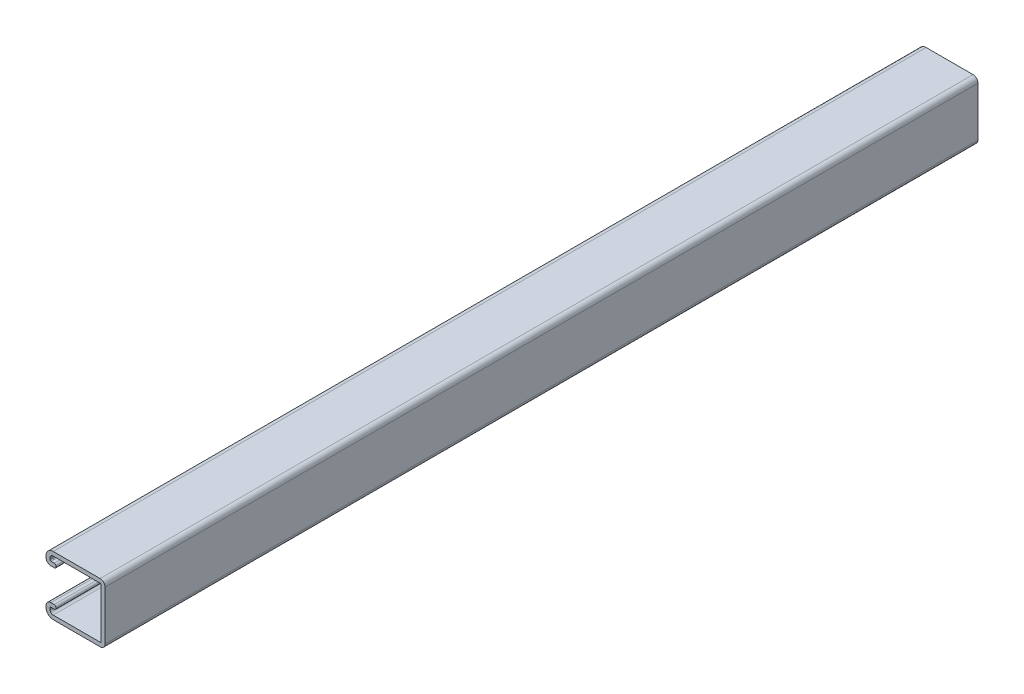
ISO-10303-21;
HEADER;
FILE_DESCRIPTION(('STEP AP214'),'2;1');
FILE_NAME('part.step','',(''),(''),'','','');
FILE_SCHEMA(('AUTOMOTIVE_DESIGN { 1 0 10303 214 1 1 1 1 }'));
ENDSEC;
DATA;
#1=APPLICATION_CONTEXT('core data for automotive mechanical design processes');
#2=APPLICATION_PROTOCOL_DEFINITION('international standard','automotive_design',2000,#1);
#3=PRODUCT_CONTEXT('',#1,'mechanical');
#4=PRODUCT('Part','Part','',(#3));
#5=PRODUCT_RELATED_PRODUCT_CATEGORY('part','',(#4));
#6=PRODUCT_DEFINITION_FORMATION('','',#4);
#7=PRODUCT_DEFINITION_CONTEXT('part definition',#1,'design');
#8=PRODUCT_DEFINITION('design','',#6,#7);
#9=PRODUCT_DEFINITION_SHAPE('','',#8);
#10=(LENGTH_UNIT() NAMED_UNIT(*) SI_UNIT(.MILLI.,.METRE.));
#11=(NAMED_UNIT(*) PLANE_ANGLE_UNIT() SI_UNIT($,.RADIAN.));
#12=(NAMED_UNIT(*) SI_UNIT($,.STERADIAN.) SOLID_ANGLE_UNIT());
#13=UNCERTAINTY_MEASURE_WITH_UNIT(LENGTH_MEASURE(1.E-05),#10,'distance_accuracy_value','');
#14=(GEOMETRIC_REPRESENTATION_CONTEXT(3) GLOBAL_UNCERTAINTY_ASSIGNED_CONTEXT((#13)) GLOBAL_UNIT_ASSIGNED_CONTEXT((#10,
#11,#12)) REPRESENTATION_CONTEXT('',''));
#15=CARTESIAN_POINT('',(0.,0.,0.));
#16=DIRECTION('',(0.,0.,1.));
#17=DIRECTION('',(1.,0.,0.));
#18=AXIS2_PLACEMENT_3D('',#15,#16,#17);
#19=CARTESIAN_POINT('',(-36.22675,15.58925,-609.6));
#20=DIRECTION('',(0.,0.,1.));
#21=DIRECTION('',(1.,0.,0.));
#22=AXIS2_PLACEMENT_3D('',#19,#20,#21);
#23=CYLINDRICAL_SURFACE('',#22,5.04825);
#24=CARTESIAN_POINT('',(-36.22675,15.58925,0.));
#25=DIRECTION('',(0.,0.,1.));
#26=DIRECTION('',(1.,0.,0.));
#27=AXIS2_PLACEMENT_3D('',#24,#25,#26);
#28=CIRCLE('',#27,5.04825);
#29=CARTESIAN_POINT('',(-36.22675,20.6375,0.));
#30=VERTEX_POINT('',#29);
#31=CARTESIAN_POINT('',(-41.275,15.58925,0.));
#32=VERTEX_POINT('',#31);
#33=EDGE_CURVE('E256',#30,#32,#28,.T.);
#34=ORIENTED_EDGE('',*,*,#33,.F.);
#35=DIRECTION('',(0.,0.,1.));
#36=VECTOR('',#35,1.);
#37=CARTESIAN_POINT('',(-36.22675,20.6375,-609.6));
#38=LINE('',#37,#36);
#39=CARTESIAN_POINT('',(-36.22675,20.6375,-609.6));
#40=VERTEX_POINT('',#39);
#41=EDGE_CURVE('E11',#40,#30,#38,.T.);
#42=ORIENTED_EDGE('',*,*,#41,.F.);
#43=CARTESIAN_POINT('',(-36.22675,15.58925,-609.6));
#44=DIRECTION('',(0.,0.,1.));
#45=DIRECTION('',(1.,0.,0.));
#46=AXIS2_PLACEMENT_3D('',#43,#44,#45);
#47=CIRCLE('',#46,5.04825);
#48=CARTESIAN_POINT('',(-41.275,15.58925,-609.6));
#49=VERTEX_POINT('',#48);
#50=EDGE_CURVE('E336',#40,#49,#47,.T.);
#51=ORIENTED_EDGE('',*,*,#50,.T.);
#52=DIRECTION('',(0.,0.,1.));
#53=VECTOR('',#52,1.);
#54=CARTESIAN_POINT('',(-41.275,15.58925,-609.6));
#55=LINE('',#54,#53);
#56=EDGE_CURVE('E42',#49,#32,#55,.T.);
#57=ORIENTED_EDGE('',*,*,#56,.T.);
#58=EDGE_LOOP('',(#34,#42,#51,#57));
#59=FACE_BOUND('',#58,.T.);
#60=ADVANCED_FACE('F39',(#59),#23,.T.);
#61=CARTESIAN_POINT('',(-36.22675,20.6375,-609.6));
#62=DIRECTION('',(0.,1.,0.));
#63=DIRECTION('',(-1.,0.,0.));
#64=AXIS2_PLACEMENT_3D('',#61,#62,#63);
#65=PLANE('',#64);
#66=DIRECTION('',(-1.,0.,0.));
#67=VECTOR('',#66,1.);
#68=CARTESIAN_POINT('',(-36.22675,20.6375,0.));
#69=LINE('',#68,#67);
#70=CARTESIAN_POINT('',(-3.46075,20.6375,0.));
#71=VERTEX_POINT('',#70);
#72=EDGE_CURVE('E334',#71,#30,#69,.T.);
#73=ORIENTED_EDGE('',*,*,#72,.F.);
#74=DIRECTION('',(0.,0.,1.));
#75=VECTOR('',#74,1.);
#76=CARTESIAN_POINT('',(-3.46075,20.6375,-609.6));
#77=LINE('',#76,#75);
#78=CARTESIAN_POINT('',(-3.46075,20.6375,-609.6));
#79=VERTEX_POINT('',#78);
#80=EDGE_CURVE('E48',#79,#71,#77,.T.);
#81=ORIENTED_EDGE('',*,*,#80,.F.);
#82=DIRECTION('',(-1.,0.,0.));
#83=VECTOR('',#82,1.);
#84=CARTESIAN_POINT('',(-36.22675,20.6375,-609.6));
#85=LINE('',#84,#83);
#86=EDGE_CURVE('E246',#79,#40,#85,.T.);
#87=ORIENTED_EDGE('',*,*,#86,.T.);
#88=ORIENTED_EDGE('',*,*,#41,.T.);
#89=EDGE_LOOP('',(#73,#81,#87,#88));
#90=FACE_BOUND('',#89,.T.);
#91=ADVANCED_FACE('F388',(#90),#65,.T.);
#92=CARTESIAN_POINT('',(-3.46075,17.17675,-609.6));
#93=DIRECTION('',(0.,0.,1.));
#94=DIRECTION('',(1.,0.,0.));
#95=AXIS2_PLACEMENT_3D('',#92,#93,#94);
#96=CYLINDRICAL_SURFACE('',#95,3.46075);
#97=CARTESIAN_POINT('',(-3.46075,17.17675,0.));
#98=DIRECTION('',(0.,0.,1.));
#99=DIRECTION('',(1.,0.,0.));
#100=AXIS2_PLACEMENT_3D('',#97,#98,#99);
#101=CIRCLE('',#100,3.46075);
#102=CARTESIAN_POINT('',(0.,17.17675,0.));
#103=VERTEX_POINT('',#102);
#104=EDGE_CURVE('E233',#103,#71,#101,.T.);
#105=ORIENTED_EDGE('',*,*,#104,.F.);
#106=DIRECTION('',(0.,0.,1.));
#107=VECTOR('',#106,1.);
#108=CARTESIAN_POINT('',(0.,17.17675,-609.6));
#109=LINE('',#108,#107);
#110=CARTESIAN_POINT('',(0.,17.17675,-609.6));
#111=VERTEX_POINT('',#110);
#112=EDGE_CURVE('E228',#111,#103,#109,.T.);
#113=ORIENTED_EDGE('',*,*,#112,.F.);
#114=CARTESIAN_POINT('',(-3.46075,17.17675,-609.6));
#115=DIRECTION('',(0.,0.,1.));
#116=DIRECTION('',(1.,0.,0.));
#117=AXIS2_PLACEMENT_3D('',#114,#115,#116);
#118=CIRCLE('',#117,3.46075);
#119=EDGE_CURVE('E231',#111,#79,#118,.T.);
#120=ORIENTED_EDGE('',*,*,#119,.T.);
#121=ORIENTED_EDGE('',*,*,#80,.T.);
#122=EDGE_LOOP('',(#105,#113,#120,#121));
#123=FACE_BOUND('',#122,.T.);
#124=ADVANCED_FACE('F230',(#123),#96,.T.);
#125=CARTESIAN_POINT('',(0.,17.17675,-609.6));
#126=DIRECTION('',(1.,0.,0.));
#127=DIRECTION('',(0.,1.,0.));
#128=AXIS2_PLACEMENT_3D('',#125,#126,#127);
#129=PLANE('',#128);
#130=DIRECTION('',(0.,1.,0.));
#131=VECTOR('',#130,1.);
#132=CARTESIAN_POINT('',(0.,17.17675,0.));
#133=LINE('',#132,#131);
#134=CARTESIAN_POINT('',(0.,-17.17675,0.));
#135=VERTEX_POINT('',#134);
#136=EDGE_CURVE('E331',#135,#103,#133,.T.);
#137=ORIENTED_EDGE('',*,*,#136,.F.);
#138=DIRECTION('',(0.,0.,1.));
#139=VECTOR('',#138,1.);
#140=CARTESIAN_POINT('',(0.,-17.17675,-609.6));
#141=LINE('',#140,#139);
#142=CARTESIAN_POINT('',(0.,-17.17675,-609.6));
#143=VERTEX_POINT('',#142);
#144=EDGE_CURVE('E238',#143,#135,#141,.T.);
#145=ORIENTED_EDGE('',*,*,#144,.F.);
#146=DIRECTION('',(0.,1.,0.));
#147=VECTOR('',#146,1.);
#148=CARTESIAN_POINT('',(0.,17.17675,-609.6));
#149=LINE('',#148,#147);
#150=EDGE_CURVE('E244',#143,#111,#149,.T.);
#151=ORIENTED_EDGE('',*,*,#150,.T.);
#152=ORIENTED_EDGE('',*,*,#112,.T.);
#153=EDGE_LOOP('',(#137,#145,#151,#152));
#154=FACE_BOUND('',#153,.T.);
#155=ADVANCED_FACE('F248',(#154),#129,.T.);
#156=CARTESIAN_POINT('',(-3.46075,-17.17675,-609.6));
#157=DIRECTION('',(0.,0.,1.));
#158=DIRECTION('',(1.,0.,0.));
#159=AXIS2_PLACEMENT_3D('',#156,#157,#158);
#160=CYLINDRICAL_SURFACE('',#159,3.46075);
#161=CARTESIAN_POINT('',(-3.46075,-17.17675,0.));
#162=DIRECTION('',(0.,0.,1.));
#163=DIRECTION('',(-1.,0.,0.));
#164=AXIS2_PLACEMENT_3D('',#161,#162,#163);
#165=CIRCLE('',#164,3.46075);
#166=CARTESIAN_POINT('',(-3.46075,-20.6375,0.));
#167=VERTEX_POINT('',#166);
#168=EDGE_CURVE('E328',#167,#135,#165,.T.);
#169=ORIENTED_EDGE('',*,*,#168,.F.);
#170=DIRECTION('',(0.,0.,1.));
#171=VECTOR('',#170,1.);
#172=CARTESIAN_POINT('',(-3.46075,-20.6375,-609.6));
#173=LINE('',#172,#171);
#174=CARTESIAN_POINT('',(-3.46075,-20.6375,-609.6));
#175=VERTEX_POINT('',#174);
#176=EDGE_CURVE('E340',#175,#167,#173,.T.);
#177=ORIENTED_EDGE('',*,*,#176,.F.);
#178=CARTESIAN_POINT('',(-3.46075,-17.17675,-609.6));
#179=DIRECTION('',(0.,0.,1.));
#180=DIRECTION('',(-1.,0.,0.));
#181=AXIS2_PLACEMENT_3D('',#178,#179,#180);
#182=CIRCLE('',#181,3.46075);
#183=EDGE_CURVE('E249',#175,#143,#182,.T.);
#184=ORIENTED_EDGE('',*,*,#183,.T.);
#185=ORIENTED_EDGE('',*,*,#144,.T.);
#186=EDGE_LOOP('',(#169,#177,#184,#185));
#187=FACE_BOUND('',#186,.T.);
#188=ADVANCED_FACE('F401',(#187),#160,.T.);
#189=CARTESIAN_POINT('',(-36.22675,-20.6375,-609.6));
#190=DIRECTION('',(0.,-1.,0.));
#191=DIRECTION('',(1.,0.,0.));
#192=AXIS2_PLACEMENT_3D('',#189,#190,#191);
#193=PLANE('',#192);
#194=DIRECTION('',(1.,0.,0.));
#195=VECTOR('',#194,1.);
#196=CARTESIAN_POINT('',(-36.22675,-20.6375,0.));
#197=LINE('',#196,#195);
#198=CARTESIAN_POINT('',(-36.22675,-20.6375,0.));
#199=VERTEX_POINT('',#198);
#200=EDGE_CURVE('E325',#199,#167,#197,.T.);
#201=ORIENTED_EDGE('',*,*,#200,.F.);
#202=DIRECTION('',(0.,0.,1.));
#203=VECTOR('',#202,1.);
#204=CARTESIAN_POINT('',(-36.22675,-20.6375,-609.6));
#205=LINE('',#204,#203);
#206=CARTESIAN_POINT('',(-36.22675,-20.6375,-609.6));
#207=VERTEX_POINT('',#206);
#208=EDGE_CURVE('E342',#207,#199,#205,.T.);
#209=ORIENTED_EDGE('',*,*,#208,.F.);
#210=DIRECTION('',(1.,0.,0.));
#211=VECTOR('',#210,1.);
#212=CARTESIAN_POINT('',(-36.22675,-20.6375,-609.6));
#213=LINE('',#212,#211);
#214=EDGE_CURVE('E251',#207,#175,#213,.T.);
#215=ORIENTED_EDGE('',*,*,#214,.T.);
#216=ORIENTED_EDGE('',*,*,#176,.T.);
#217=EDGE_LOOP('',(#201,#209,#215,#216));
#218=FACE_BOUND('',#217,.T.);
#219=ADVANCED_FACE('F404',(#218),#193,.T.);
#220=CARTESIAN_POINT('',(-36.22675,-15.58925,-609.6));
#221=DIRECTION('',(0.,0.,1.));
#222=DIRECTION('',(1.,0.,0.));
#223=AXIS2_PLACEMENT_3D('',#220,#221,#222);
#224=CYLINDRICAL_SURFACE('',#223,5.04825);
#225=CARTESIAN_POINT('',(-36.22675,-15.58925,0.));
#226=DIRECTION('',(0.,0.,1.));
#227=DIRECTION('',(-1.,0.,0.));
#228=AXIS2_PLACEMENT_3D('',#225,#226,#227);
#229=CIRCLE('',#228,5.04825);
#230=CARTESIAN_POINT('',(-41.275,-15.58925,0.));
#231=VERTEX_POINT('',#230);
#232=EDGE_CURVE('E322',#231,#199,#229,.T.);
#233=ORIENTED_EDGE('',*,*,#232,.F.);
#234=DIRECTION('',(0.,0.,1.));
#235=VECTOR('',#234,1.);
#236=CARTESIAN_POINT('',(-41.275,-15.58925,-609.6));
#237=LINE('',#236,#235);
#238=CARTESIAN_POINT('',(-41.275,-15.58925,-609.6));
#239=VERTEX_POINT('',#238);
#240=EDGE_CURVE('E344',#239,#231,#237,.T.);
#241=ORIENTED_EDGE('',*,*,#240,.F.);
#242=CARTESIAN_POINT('',(-36.22675,-15.58925,-609.6));
#243=DIRECTION('',(0.,0.,1.));
#244=DIRECTION('',(-1.,0.,0.));
#245=AXIS2_PLACEMENT_3D('',#242,#243,#244);
#246=CIRCLE('',#245,5.04825);
#247=EDGE_CURVE('E749',#239,#207,#246,.T.);
#248=ORIENTED_EDGE('',*,*,#247,.T.);
#249=ORIENTED_EDGE('',*,*,#208,.T.);
#250=EDGE_LOOP('',(#233,#241,#248,#249));
#251=FACE_BOUND('',#250,.T.);
#252=ADVANCED_FACE('F408',(#251),#224,.T.);
#253=CARTESIAN_POINT('',(-41.275,-15.58925,-609.6));
#254=DIRECTION('',(-1.,0.,0.));
#255=DIRECTION('',(0.,0.,1.));
#256=AXIS2_PLACEMENT_3D('',#253,#254,#255);
#257=PLANE('',#256);
#258=DIRECTION('',(0.,-1.,0.));
#259=VECTOR('',#258,1.);
#260=CARTESIAN_POINT('',(-41.275,-15.58925,0.));
#261=LINE('',#260,#259);
#262=CARTESIAN_POINT('',(-41.275,-14.57325,0.));
#263=VERTEX_POINT('',#262);
#264=EDGE_CURVE('E319',#263,#231,#261,.T.);
#265=ORIENTED_EDGE('',*,*,#264,.F.);
#266=DIRECTION('',(0.,0.,1.));
#267=VECTOR('',#266,1.);
#268=CARTESIAN_POINT('',(-41.275,-14.57325,-609.6));
#269=LINE('',#268,#267);
#270=CARTESIAN_POINT('',(-41.275,-14.57325,-609.6));
#271=VERTEX_POINT('',#270);
#272=EDGE_CURVE('E346',#271,#263,#269,.T.);
#273=ORIENTED_EDGE('',*,*,#272,.F.);
#274=DIRECTION('',(0.,-1.,0.));
#275=VECTOR('',#274,1.);
#276=CARTESIAN_POINT('',(-41.275,-15.58925,-609.6));
#277=LINE('',#276,#275);
#278=EDGE_CURVE('E745',#271,#239,#277,.T.);
#279=ORIENTED_EDGE('',*,*,#278,.T.);
#280=ORIENTED_EDGE('',*,*,#240,.T.);
#281=EDGE_LOOP('',(#265,#273,#279,#280));
#282=FACE_BOUND('',#281,.T.);
#283=ADVANCED_FACE('F412',(#282),#257,.T.);
#284=CARTESIAN_POINT('',(-37.81425,-14.57325,-609.6));
#285=DIRECTION('',(0.,0.,1.));
#286=DIRECTION('',(1.,0.,0.));
#287=AXIS2_PLACEMENT_3D('',#284,#285,#286);
#288=CYLINDRICAL_SURFACE('',#287,3.46075);
#289=CARTESIAN_POINT('',(-37.81425,-14.57325,0.));
#290=DIRECTION('',(0.,0.,1.));
#291=DIRECTION('',(-1.,0.,0.));
#292=AXIS2_PLACEMENT_3D('',#289,#290,#291);
#293=CIRCLE('',#292,3.46075);
#294=CARTESIAN_POINT('',(-37.81425,-11.1125,0.));
#295=VERTEX_POINT('',#294);
#296=EDGE_CURVE('E316',#295,#263,#293,.T.);
#297=ORIENTED_EDGE('',*,*,#296,.F.);
#298=DIRECTION('',(0.,0.,1.));
#299=VECTOR('',#298,1.);
#300=CARTESIAN_POINT('',(-37.81425,-11.1125,-609.6));
#301=LINE('',#300,#299);
#302=CARTESIAN_POINT('',(-37.81425,-11.1125,-609.6));
#303=VERTEX_POINT('',#302);
#304=EDGE_CURVE('E348',#303,#295,#301,.T.);
#305=ORIENTED_EDGE('',*,*,#304,.F.);
#306=CARTESIAN_POINT('',(-37.81425,-14.57325,-609.6));
#307=DIRECTION('',(0.,0.,1.));
#308=DIRECTION('',(-1.,0.,0.));
#309=AXIS2_PLACEMENT_3D('',#306,#307,#308);
#310=CIRCLE('',#309,3.46075);
#311=EDGE_CURVE('E756',#303,#271,#310,.T.);
#312=ORIENTED_EDGE('',*,*,#311,.T.);
#313=ORIENTED_EDGE('',*,*,#272,.T.);
#314=EDGE_LOOP('',(#297,#305,#312,#313));
#315=FACE_BOUND('',#314,.T.);
#316=ADVANCED_FACE('F416',(#315),#288,.T.);
#317=CARTESIAN_POINT('',(-37.81425,-11.1125,-609.6));
#318=DIRECTION('',(0.,1.,0.));
#319=DIRECTION('',(-1.,0.,0.));
#320=AXIS2_PLACEMENT_3D('',#317,#318,#319);
#321=PLANE('',#320);
#322=DIRECTION('',(-1.,0.,0.));
#323=VECTOR('',#322,1.);
#324=CARTESIAN_POINT('',(-37.81425,-11.1125,0.));
#325=LINE('',#324,#323);
#326=CARTESIAN_POINT('',(-35.5346,-11.1125,0.));
#327=VERTEX_POINT('',#326);
#328=EDGE_CURVE('E313',#327,#295,#325,.T.);
#329=ORIENTED_EDGE('',*,*,#328,.F.);
#330=DIRECTION('',(0.,0.,1.));
#331=VECTOR('',#330,1.);
#332=CARTESIAN_POINT('',(-35.5346,-11.1125,-609.6));
#333=LINE('',#332,#331);
#334=CARTESIAN_POINT('',(-35.5346,-11.1125,-609.6));
#335=VERTEX_POINT('',#334);
#336=EDGE_CURVE('E350',#335,#327,#333,.T.);
#337=ORIENTED_EDGE('',*,*,#336,.F.);
#338=DIRECTION('',(-1.,0.,0.));
#339=VECTOR('',#338,1.);
#340=CARTESIAN_POINT('',(-37.81425,-11.1125,-609.6));
#341=LINE('',#340,#339);
#342=EDGE_CURVE('E738',#335,#303,#341,.T.);
#343=ORIENTED_EDGE('',*,*,#342,.T.);
#344=ORIENTED_EDGE('',*,*,#304,.T.);
#345=EDGE_LOOP('',(#329,#337,#343,#344));
#346=FACE_BOUND('',#345,.T.);
#347=ADVANCED_FACE('F420',(#346),#321,.T.);
#348=CARTESIAN_POINT('',(-35.5346,-12.5095,-609.6));
#349=DIRECTION('',(0.,0.,1.));
#350=DIRECTION('',(1.,0.,0.));
#351=AXIS2_PLACEMENT_3D('',#348,#349,#350);
#352=CYLINDRICAL_SURFACE('',#351,1.397);
#353=CARTESIAN_POINT('',(-35.5346,-12.5095,0.));
#354=DIRECTION('',(0.,0.,1.));
#355=DIRECTION('',(-1.,0.,0.));
#356=AXIS2_PLACEMENT_3D('',#353,#354,#355);
#357=CIRCLE('',#356,1.397);
#358=CARTESIAN_POINT('',(-35.5346,-13.9065,0.));
#359=VERTEX_POINT('',#358);
#360=EDGE_CURVE('E310',#359,#327,#357,.T.);
#361=ORIENTED_EDGE('',*,*,#360,.F.);
#362=DIRECTION('',(0.,0.,1.));
#363=VECTOR('',#362,1.);
#364=CARTESIAN_POINT('',(-35.5346,-13.9065,-609.6));
#365=LINE('',#364,#363);
#366=CARTESIAN_POINT('',(-35.5346,-13.9065,-609.6));
#367=VERTEX_POINT('',#366);
#368=EDGE_CURVE('E352',#367,#359,#365,.T.);
#369=ORIENTED_EDGE('',*,*,#368,.F.);
#370=CARTESIAN_POINT('',(-35.5346,-12.5095,-609.6));
#371=DIRECTION('',(0.,0.,1.));
#372=DIRECTION('',(-1.,0.,0.));
#373=AXIS2_PLACEMENT_3D('',#370,#371,#372);
#374=CIRCLE('',#373,1.397);
#375=EDGE_CURVE('E734',#367,#335,#374,.T.);
#376=ORIENTED_EDGE('',*,*,#375,.T.);
#377=ORIENTED_EDGE('',*,*,#336,.T.);
#378=EDGE_LOOP('',(#361,#369,#376,#377));
#379=FACE_BOUND('',#378,.T.);
#380=ADVANCED_FACE('F424',(#379),#352,.T.);
#381=CARTESIAN_POINT('',(-35.5346,-13.9065,-609.6));
#382=DIRECTION('',(0.,-1.,0.));
#383=DIRECTION('',(0.,0.,-1.));
#384=AXIS2_PLACEMENT_3D('',#381,#382,#383);
#385=PLANE('',#384);
#386=DIRECTION('',(1.,0.,0.));
#387=VECTOR('',#386,1.);
#388=CARTESIAN_POINT('',(-35.5346,-13.9065,0.));
#389=LINE('',#388,#387);
#390=CARTESIAN_POINT('',(-37.81425,-13.9065,0.));
#391=VERTEX_POINT('',#390);
#392=EDGE_CURVE('E307',#391,#359,#389,.T.);
#393=ORIENTED_EDGE('',*,*,#392,.F.);
#394=DIRECTION('',(0.,0.,1.));
#395=VECTOR('',#394,1.);
#396=CARTESIAN_POINT('',(-37.81425,-13.9065,-609.6));
#397=LINE('',#396,#395);
#398=CARTESIAN_POINT('',(-37.81425,-13.9065,-609.6));
#399=VERTEX_POINT('',#398);
#400=EDGE_CURVE('E354',#399,#391,#397,.T.);
#401=ORIENTED_EDGE('',*,*,#400,.F.);
#402=DIRECTION('',(1.,0.,0.));
#403=VECTOR('',#402,1.);
#404=CARTESIAN_POINT('',(-35.5346,-13.9065,-609.6));
#405=LINE('',#404,#403);
#406=EDGE_CURVE('E760',#399,#367,#405,.T.);
#407=ORIENTED_EDGE('',*,*,#406,.T.);
#408=ORIENTED_EDGE('',*,*,#368,.T.);
#409=EDGE_LOOP('',(#393,#401,#407,#408));
#410=FACE_BOUND('',#409,.T.);
#411=ADVANCED_FACE('F428',(#410),#385,.T.);
#412=CARTESIAN_POINT('',(-37.81425,-14.57325,-609.6));
#413=DIRECTION('',(0.,0.,1.));
#414=DIRECTION('',(1.,0.,0.));
#415=AXIS2_PLACEMENT_3D('',#412,#413,#414);
#416=CYLINDRICAL_SURFACE('',#415,0.666750000000008);
#417=CARTESIAN_POINT('',(-37.81425,-14.57325,0.));
#418=DIRECTION('',(0.,0.,-1.));
#419=DIRECTION('',(1.,0.,0.));
#420=AXIS2_PLACEMENT_3D('',#417,#418,#419);
#421=CIRCLE('',#420,0.666750000000008);
#422=CARTESIAN_POINT('',(-38.481,-14.57325,0.));
#423=VERTEX_POINT('',#422);
#424=EDGE_CURVE('E304',#423,#391,#421,.T.);
#425=ORIENTED_EDGE('',*,*,#424,.F.);
#426=DIRECTION('',(0.,0.,1.));
#427=VECTOR('',#426,1.);
#428=CARTESIAN_POINT('',(-38.481,-14.57325,-609.6));
#429=LINE('',#428,#427);
#430=CARTESIAN_POINT('',(-38.481,-14.57325,-609.6));
#431=VERTEX_POINT('',#430);
#432=EDGE_CURVE('E356',#431,#423,#429,.T.);
#433=ORIENTED_EDGE('',*,*,#432,.F.);
#434=CARTESIAN_POINT('',(-37.81425,-14.57325,-609.6));
#435=DIRECTION('',(0.,0.,-1.));
#436=DIRECTION('',(1.,0.,0.));
#437=AXIS2_PLACEMENT_3D('',#434,#435,#436);
#438=CIRCLE('',#437,0.666750000000008);
#439=EDGE_CURVE('E727',#431,#399,#438,.T.);
#440=ORIENTED_EDGE('',*,*,#439,.T.);
#441=ORIENTED_EDGE('',*,*,#400,.T.);
#442=EDGE_LOOP('',(#425,#433,#440,#441));
#443=FACE_BOUND('',#442,.T.);
#444=ADVANCED_FACE('F432',(#443),#416,.F.);
#445=CARTESIAN_POINT('',(-38.481,-14.57325,-609.6));
#446=DIRECTION('',(1.,0.,0.));
#447=DIRECTION('',(0.,0.,-1.));
#448=AXIS2_PLACEMENT_3D('',#445,#446,#447);
#449=PLANE('',#448);
#450=DIRECTION('',(0.,1.,0.));
#451=VECTOR('',#450,1.);
#452=CARTESIAN_POINT('',(-38.481,-14.57325,0.));
#453=LINE('',#452,#451);
#454=CARTESIAN_POINT('',(-38.481,-15.58925,0.));
#455=VERTEX_POINT('',#454);
#456=EDGE_CURVE('E301',#455,#423,#453,.T.);
#457=ORIENTED_EDGE('',*,*,#456,.F.);
#458=DIRECTION('',(0.,0.,1.));
#459=VECTOR('',#458,1.);
#460=CARTESIAN_POINT('',(-38.481,-15.58925,-609.6));
#461=LINE('',#460,#459);
#462=CARTESIAN_POINT('',(-38.481,-15.58925,-609.6));
#463=VERTEX_POINT('',#462);
#464=EDGE_CURVE('E358',#463,#455,#461,.T.);
#465=ORIENTED_EDGE('',*,*,#464,.F.);
#466=DIRECTION('',(0.,1.,0.));
#467=VECTOR('',#466,1.);
#468=CARTESIAN_POINT('',(-38.481,-14.57325,-609.6));
#469=LINE('',#468,#467);
#470=EDGE_CURVE('E723',#463,#431,#469,.T.);
#471=ORIENTED_EDGE('',*,*,#470,.T.);
#472=ORIENTED_EDGE('',*,*,#432,.T.);
#473=EDGE_LOOP('',(#457,#465,#471,#472));
#474=FACE_BOUND('',#473,.T.);
#475=ADVANCED_FACE('F436',(#474),#449,.T.);
#476=CARTESIAN_POINT('',(-36.22675,-15.58925,-609.6));
#477=DIRECTION('',(0.,0.,1.));
#478=DIRECTION('',(1.,0.,0.));
#479=AXIS2_PLACEMENT_3D('',#476,#477,#478);
#480=CYLINDRICAL_SURFACE('',#479,2.25425);
#481=CARTESIAN_POINT('',(-36.22675,-15.58925,0.));
#482=DIRECTION('',(0.,0.,-1.));
#483=DIRECTION('',(1.,0.,0.));
#484=AXIS2_PLACEMENT_3D('',#481,#482,#483);
#485=CIRCLE('',#484,2.25425);
#486=CARTESIAN_POINT('',(-36.22675,-17.8435,0.));
#487=VERTEX_POINT('',#486);
#488=EDGE_CURVE('E298',#487,#455,#485,.T.);
#489=ORIENTED_EDGE('',*,*,#488,.F.);
#490=DIRECTION('',(0.,0.,1.));
#491=VECTOR('',#490,1.);
#492=CARTESIAN_POINT('',(-36.22675,-17.8435,-609.6));
#493=LINE('',#492,#491);
#494=CARTESIAN_POINT('',(-36.22675,-17.8435,-609.6));
#495=VERTEX_POINT('',#494);
#496=EDGE_CURVE('E360',#495,#487,#493,.T.);
#497=ORIENTED_EDGE('',*,*,#496,.F.);
#498=CARTESIAN_POINT('',(-36.22675,-15.58925,-609.6));
#499=DIRECTION('',(0.,0.,-1.));
#500=DIRECTION('',(1.,0.,0.));
#501=AXIS2_PLACEMENT_3D('',#498,#499,#500);
#502=CIRCLE('',#501,2.25425);
#503=EDGE_CURVE('E764',#495,#463,#502,.T.);
#504=ORIENTED_EDGE('',*,*,#503,.T.);
#505=ORIENTED_EDGE('',*,*,#464,.T.);
#506=EDGE_LOOP('',(#489,#497,#504,#505));
#507=FACE_BOUND('',#506,.T.);
#508=ADVANCED_FACE('F440',(#507),#480,.F.);
#509=CARTESIAN_POINT('',(-3.46075,-17.8435,-609.6));
#510=DIRECTION('',(0.,1.,0.));
#511=DIRECTION('',(-1.,0.,0.));
#512=AXIS2_PLACEMENT_3D('',#509,#510,#511);
#513=PLANE('',#512);
#514=DIRECTION('',(-1.,0.,0.));
#515=VECTOR('',#514,1.);
#516=CARTESIAN_POINT('',(-3.46075,-17.8435,0.));
#517=LINE('',#516,#515);
#518=CARTESIAN_POINT('',(-3.46075,-17.8435,0.));
#519=VERTEX_POINT('',#518);
#520=EDGE_CURVE('E295',#519,#487,#517,.T.);
#521=ORIENTED_EDGE('',*,*,#520,.F.);
#522=DIRECTION('',(0.,0.,1.));
#523=VECTOR('',#522,1.);
#524=CARTESIAN_POINT('',(-3.46075,-17.8435,-609.6));
#525=LINE('',#524,#523);
#526=CARTESIAN_POINT('',(-3.46075,-17.8435,-609.6));
#527=VERTEX_POINT('',#526);
#528=EDGE_CURVE('E362',#527,#519,#525,.T.);
#529=ORIENTED_EDGE('',*,*,#528,.F.);
#530=DIRECTION('',(-1.,0.,0.));
#531=VECTOR('',#530,1.);
#532=CARTESIAN_POINT('',(-3.46075,-17.8435,-609.6));
#533=LINE('',#532,#531);
#534=EDGE_CURVE('E716',#527,#495,#533,.T.);
#535=ORIENTED_EDGE('',*,*,#534,.T.);
#536=ORIENTED_EDGE('',*,*,#496,.T.);
#537=EDGE_LOOP('',(#521,#529,#535,#536));
#538=FACE_BOUND('',#537,.T.);
#539=ADVANCED_FACE('F444',(#538),#513,.T.);
#540=CARTESIAN_POINT('',(-3.46075,-17.17675,-609.6));
#541=DIRECTION('',(0.,0.,1.));
#542=DIRECTION('',(1.,0.,0.));
#543=AXIS2_PLACEMENT_3D('',#540,#541,#542);
#544=CYLINDRICAL_SURFACE('',#543,0.666750000000002);
#545=CARTESIAN_POINT('',(-3.46075,-17.17675,0.));
#546=DIRECTION('',(0.,0.,-1.));
#547=DIRECTION('',(-1.,0.,0.));
#548=AXIS2_PLACEMENT_3D('',#545,#546,#547);
#549=CIRCLE('',#548,0.666750000000002);
#550=CARTESIAN_POINT('',(-2.79399999999999,-17.17675,0.));
#551=VERTEX_POINT('',#550);
#552=EDGE_CURVE('E292',#551,#519,#549,.T.);
#553=ORIENTED_EDGE('',*,*,#552,.F.);
#554=DIRECTION('',(0.,0.,1.));
#555=VECTOR('',#554,1.);
#556=CARTESIAN_POINT('',(-2.79399999999999,-17.17675,-609.6));
#557=LINE('',#556,#555);
#558=CARTESIAN_POINT('',(-2.79399999999999,-17.17675,-609.6));
#559=VERTEX_POINT('',#558);
#560=EDGE_CURVE('E364',#559,#551,#557,.T.);
#561=ORIENTED_EDGE('',*,*,#560,.F.);
#562=CARTESIAN_POINT('',(-3.46075,-17.17675,-609.6));
#563=DIRECTION('',(0.,0.,-1.));
#564=DIRECTION('',(-1.,0.,0.));
#565=AXIS2_PLACEMENT_3D('',#562,#563,#564);
#566=CIRCLE('',#565,0.666750000000002);
#567=EDGE_CURVE('E712',#559,#527,#566,.T.);
#568=ORIENTED_EDGE('',*,*,#567,.T.);
#569=ORIENTED_EDGE('',*,*,#528,.T.);
#570=EDGE_LOOP('',(#553,#561,#568,#569));
#571=FACE_BOUND('',#570,.T.);
#572=ADVANCED_FACE('F448',(#571),#544,.F.);
#573=CARTESIAN_POINT('',(-2.794,-17.17675,-609.6));
#574=DIRECTION('',(-1.,0.,0.));
#575=DIRECTION('',(0.,-1.,0.));
#576=AXIS2_PLACEMENT_3D('',#573,#574,#575);
#577=PLANE('',#576);
#578=DIRECTION('',(0.,-1.,0.));
#579=VECTOR('',#578,1.);
#580=CARTESIAN_POINT('',(-2.794,-17.17675,0.));
#581=LINE('',#580,#579);
#582=CARTESIAN_POINT('',(-2.794,17.17675,0.));
#583=VERTEX_POINT('',#582);
#584=EDGE_CURVE('E289',#583,#551,#581,.T.);
#585=ORIENTED_EDGE('',*,*,#584,.F.);
#586=DIRECTION('',(0.,0.,1.));
#587=VECTOR('',#586,1.);
#588=CARTESIAN_POINT('',(-2.794,17.17675,-609.6));
#589=LINE('',#588,#587);
#590=CARTESIAN_POINT('',(-2.794,17.17675,-609.6));
#591=VERTEX_POINT('',#590);
#592=EDGE_CURVE('E366',#591,#583,#589,.T.);
#593=ORIENTED_EDGE('',*,*,#592,.F.);
#594=DIRECTION('',(0.,-1.,0.));
#595=VECTOR('',#594,1.);
#596=CARTESIAN_POINT('',(-2.794,-17.17675,-609.6));
#597=LINE('',#596,#595);
#598=EDGE_CURVE('E768',#591,#559,#597,.T.);
#599=ORIENTED_EDGE('',*,*,#598,.T.);
#600=ORIENTED_EDGE('',*,*,#560,.T.);
#601=EDGE_LOOP('',(#585,#593,#599,#600));
#602=FACE_BOUND('',#601,.T.);
#603=ADVANCED_FACE('F452',(#602),#577,.T.);
#604=CARTESIAN_POINT('',(-3.46075,17.17675,-609.6));
#605=DIRECTION('',(0.,0.,1.));
#606=DIRECTION('',(1.,0.,0.));
#607=AXIS2_PLACEMENT_3D('',#604,#605,#606);
#608=CYLINDRICAL_SURFACE('',#607,0.666750000000002);
#609=CARTESIAN_POINT('',(-3.46075,17.17675,0.));
#610=DIRECTION('',(0.,0.,-1.));
#611=DIRECTION('',(1.,0.,0.));
#612=AXIS2_PLACEMENT_3D('',#609,#610,#611);
#613=CIRCLE('',#612,0.666750000000002);
#614=CARTESIAN_POINT('',(-3.46075,17.8435,0.));
#615=VERTEX_POINT('',#614);
#616=EDGE_CURVE('E286',#615,#583,#613,.T.);
#617=ORIENTED_EDGE('',*,*,#616,.F.);
#618=DIRECTION('',(0.,0.,1.));
#619=VECTOR('',#618,1.);
#620=CARTESIAN_POINT('',(-3.46075,17.8435,-609.6));
#621=LINE('',#620,#619);
#622=CARTESIAN_POINT('',(-3.46075,17.8435,-609.6));
#623=VERTEX_POINT('',#622);
#624=EDGE_CURVE('E368',#623,#615,#621,.T.);
#625=ORIENTED_EDGE('',*,*,#624,.F.);
#626=CARTESIAN_POINT('',(-3.46075,17.17675,-609.6));
#627=DIRECTION('',(0.,0.,-1.));
#628=DIRECTION('',(1.,0.,0.));
#629=AXIS2_PLACEMENT_3D('',#626,#627,#628);
#630=CIRCLE('',#629,0.666750000000002);
#631=EDGE_CURVE('E705',#623,#591,#630,.T.);
#632=ORIENTED_EDGE('',*,*,#631,.T.);
#633=ORIENTED_EDGE('',*,*,#592,.T.);
#634=EDGE_LOOP('',(#617,#625,#632,#633));
#635=FACE_BOUND('',#634,.T.);
#636=ADVANCED_FACE('F456',(#635),#608,.F.);
#637=CARTESIAN_POINT('',(-3.46075,17.8435,-609.6));
#638=DIRECTION('',(0.,-1.,0.));
#639=DIRECTION('',(0.,0.,-1.));
#640=AXIS2_PLACEMENT_3D('',#637,#638,#639);
#641=PLANE('',#640);
#642=DIRECTION('',(1.,0.,0.));
#643=VECTOR('',#642,1.);
#644=CARTESIAN_POINT('',(-3.46075,17.8435,0.));
#645=LINE('',#644,#643);
#646=CARTESIAN_POINT('',(-36.22675,17.8435,0.));
#647=VERTEX_POINT('',#646);
#648=EDGE_CURVE('E283',#647,#615,#645,.T.);
#649=ORIENTED_EDGE('',*,*,#648,.F.);
#650=DIRECTION('',(0.,0.,1.));
#651=VECTOR('',#650,1.);
#652=CARTESIAN_POINT('',(-36.22675,17.8435,-609.6));
#653=LINE('',#652,#651);
#654=CARTESIAN_POINT('',(-36.22675,17.8435,-609.6));
#655=VERTEX_POINT('',#654);
#656=EDGE_CURVE('E370',#655,#647,#653,.T.);
#657=ORIENTED_EDGE('',*,*,#656,.F.);
#658=DIRECTION('',(1.,0.,0.));
#659=VECTOR('',#658,1.);
#660=CARTESIAN_POINT('',(-3.46075,17.8435,-609.6));
#661=LINE('',#660,#659);
#662=EDGE_CURVE('E701',#655,#623,#661,.T.);
#663=ORIENTED_EDGE('',*,*,#662,.T.);
#664=ORIENTED_EDGE('',*,*,#624,.T.);
#665=EDGE_LOOP('',(#649,#657,#663,#664));
#666=FACE_BOUND('',#665,.T.);
#667=ADVANCED_FACE('F460',(#666),#641,.T.);
#668=CARTESIAN_POINT('',(-36.22675,15.58925,-609.6));
#669=DIRECTION('',(0.,0.,1.));
#670=DIRECTION('',(1.,0.,0.));
#671=AXIS2_PLACEMENT_3D('',#668,#669,#670);
#672=CYLINDRICAL_SURFACE('',#671,2.25425);
#673=CARTESIAN_POINT('',(-36.22675,15.58925,0.));
#674=DIRECTION('',(0.,0.,-1.));
#675=DIRECTION('',(-1.,0.,0.));
#676=AXIS2_PLACEMENT_3D('',#673,#674,#675);
#677=CIRCLE('',#676,2.25425);
#678=CARTESIAN_POINT('',(-38.481,15.58925,0.));
#679=VERTEX_POINT('',#678);
#680=EDGE_CURVE('E280',#679,#647,#677,.T.);
#681=ORIENTED_EDGE('',*,*,#680,.F.);
#682=DIRECTION('',(0.,0.,1.));
#683=VECTOR('',#682,1.);
#684=CARTESIAN_POINT('',(-38.481,15.58925,-609.6));
#685=LINE('',#684,#683);
#686=CARTESIAN_POINT('',(-38.481,15.58925,-609.6));
#687=VERTEX_POINT('',#686);
#688=EDGE_CURVE('E372',#687,#679,#685,.T.);
#689=ORIENTED_EDGE('',*,*,#688,.F.);
#690=CARTESIAN_POINT('',(-36.22675,15.58925,-609.6));
#691=DIRECTION('',(0.,0.,-1.));
#692=DIRECTION('',(-1.,0.,0.));
#693=AXIS2_PLACEMENT_3D('',#690,#691,#692);
#694=CIRCLE('',#693,2.25425);
#695=EDGE_CURVE('E772',#687,#655,#694,.T.);
#696=ORIENTED_EDGE('',*,*,#695,.T.);
#697=ORIENTED_EDGE('',*,*,#656,.T.);
#698=EDGE_LOOP('',(#681,#689,#696,#697));
#699=FACE_BOUND('',#698,.T.);
#700=ADVANCED_FACE('F464',(#699),#672,.F.);
#701=CARTESIAN_POINT('',(-38.481,14.57325,-609.6));
#702=DIRECTION('',(1.,0.,0.));
#703=DIRECTION('',(0.,0.,-1.));
#704=AXIS2_PLACEMENT_3D('',#701,#702,#703);
#705=PLANE('',#704);
#706=DIRECTION('',(0.,1.,0.));
#707=VECTOR('',#706,1.);
#708=CARTESIAN_POINT('',(-38.481,14.57325,0.));
#709=LINE('',#708,#707);
#710=CARTESIAN_POINT('',(-38.481,14.57325,0.));
#711=VERTEX_POINT('',#710);
#712=EDGE_CURVE('E277',#711,#679,#709,.T.);
#713=ORIENTED_EDGE('',*,*,#712,.F.);
#714=DIRECTION('',(0.,0.,1.));
#715=VECTOR('',#714,1.);
#716=CARTESIAN_POINT('',(-38.481,14.57325,-609.6));
#717=LINE('',#716,#715);
#718=CARTESIAN_POINT('',(-38.481,14.57325,-609.6));
#719=VERTEX_POINT('',#718);
#720=EDGE_CURVE('E374',#719,#711,#717,.T.);
#721=ORIENTED_EDGE('',*,*,#720,.F.);
#722=DIRECTION('',(0.,1.,0.));
#723=VECTOR('',#722,1.);
#724=CARTESIAN_POINT('',(-38.481,14.57325,-609.6));
#725=LINE('',#724,#723);
#726=EDGE_CURVE('E694',#719,#687,#725,.T.);
#727=ORIENTED_EDGE('',*,*,#726,.T.);
#728=ORIENTED_EDGE('',*,*,#688,.T.);
#729=EDGE_LOOP('',(#713,#721,#727,#728));
#730=FACE_BOUND('',#729,.T.);
#731=ADVANCED_FACE('F468',(#730),#705,.T.);
#732=CARTESIAN_POINT('',(-37.81425,14.57325,-609.6));
#733=DIRECTION('',(0.,0.,1.));
#734=DIRECTION('',(1.,0.,0.));
#735=AXIS2_PLACEMENT_3D('',#732,#733,#734);
#736=CYLINDRICAL_SURFACE('',#735,0.666750000000008);
#737=CARTESIAN_POINT('',(-37.81425,14.57325,0.));
#738=DIRECTION('',(0.,0.,-1.));
#739=DIRECTION('',(-1.,0.,0.));
#740=AXIS2_PLACEMENT_3D('',#737,#738,#739);
#741=CIRCLE('',#740,0.666750000000008);
#742=CARTESIAN_POINT('',(-37.81425,13.9065,0.));
#743=VERTEX_POINT('',#742);
#744=EDGE_CURVE('E274',#743,#711,#741,.T.);
#745=ORIENTED_EDGE('',*,*,#744,.F.);
#746=DIRECTION('',(0.,0.,1.));
#747=VECTOR('',#746,1.);
#748=CARTESIAN_POINT('',(-37.81425,13.9065,-609.6));
#749=LINE('',#748,#747);
#750=CARTESIAN_POINT('',(-37.81425,13.9065,-609.6));
#751=VERTEX_POINT('',#750);
#752=EDGE_CURVE('E376',#751,#743,#749,.T.);
#753=ORIENTED_EDGE('',*,*,#752,.F.);
#754=CARTESIAN_POINT('',(-37.81425,14.57325,-609.6));
#755=DIRECTION('',(0.,0.,-1.));
#756=DIRECTION('',(-1.,0.,0.));
#757=AXIS2_PLACEMENT_3D('',#754,#755,#756);
#758=CIRCLE('',#757,0.666750000000008);
#759=EDGE_CURVE('E690',#751,#719,#758,.T.);
#760=ORIENTED_EDGE('',*,*,#759,.T.);
#761=ORIENTED_EDGE('',*,*,#720,.T.);
#762=EDGE_LOOP('',(#745,#753,#760,#761));
#763=FACE_BOUND('',#762,.T.);
#764=ADVANCED_FACE('F472',(#763),#736,.F.);
#765=CARTESIAN_POINT('',(-35.5346,13.9065,-609.6));
#766=DIRECTION('',(0.,1.,0.));
#767=DIRECTION('',(0.,0.,1.));
#768=AXIS2_PLACEMENT_3D('',#765,#766,#767);
#769=PLANE('',#768);
#770=DIRECTION('',(-1.,0.,0.));
#771=VECTOR('',#770,1.);
#772=CARTESIAN_POINT('',(-35.5346,13.9065,0.));
#773=LINE('',#772,#771);
#774=CARTESIAN_POINT('',(-35.5346,13.9065,0.));
#775=VERTEX_POINT('',#774);
#776=EDGE_CURVE('E271',#775,#743,#773,.T.);
#777=ORIENTED_EDGE('',*,*,#776,.F.);
#778=DIRECTION('',(0.,0.,1.));
#779=VECTOR('',#778,1.);
#780=CARTESIAN_POINT('',(-35.5346,13.9065,-609.6));
#781=LINE('',#780,#779);
#782=CARTESIAN_POINT('',(-35.5346,13.9065,-609.6));
#783=VERTEX_POINT('',#782);
#784=EDGE_CURVE('E378',#783,#775,#781,.T.);
#785=ORIENTED_EDGE('',*,*,#784,.F.);
#786=DIRECTION('',(-1.,0.,0.));
#787=VECTOR('',#786,1.);
#788=CARTESIAN_POINT('',(-35.5346,13.9065,-609.6));
#789=LINE('',#788,#787);
#790=EDGE_CURVE('E776',#783,#751,#789,.T.);
#791=ORIENTED_EDGE('',*,*,#790,.T.);
#792=ORIENTED_EDGE('',*,*,#752,.T.);
#793=EDGE_LOOP('',(#777,#785,#791,#792));
#794=FACE_BOUND('',#793,.T.);
#795=ADVANCED_FACE('F476',(#794),#769,.T.);
#796=CARTESIAN_POINT('',(-35.5346,12.5095,-609.6));
#797=DIRECTION('',(0.,0.,1.));
#798=DIRECTION('',(1.,0.,0.));
#799=AXIS2_PLACEMENT_3D('',#796,#797,#798);
#800=CYLINDRICAL_SURFACE('',#799,1.397);
#801=CARTESIAN_POINT('',(-35.5346,12.5095,0.));
#802=DIRECTION('',(0.,0.,1.));
#803=DIRECTION('',(1.,0.,0.));
#804=AXIS2_PLACEMENT_3D('',#801,#802,#803);
#805=CIRCLE('',#804,1.397);
#806=CARTESIAN_POINT('',(-35.5346,11.1125,0.));
#807=VERTEX_POINT('',#806);
#808=EDGE_CURVE('E268',#807,#775,#805,.T.);
#809=ORIENTED_EDGE('',*,*,#808,.F.);
#810=DIRECTION('',(0.,0.,1.));
#811=VECTOR('',#810,1.);
#812=CARTESIAN_POINT('',(-35.5346,11.1125,-609.6));
#813=LINE('',#812,#811);
#814=CARTESIAN_POINT('',(-35.5346,11.1125,-609.6));
#815=VERTEX_POINT('',#814);
#816=EDGE_CURVE('E380',#815,#807,#813,.T.);
#817=ORIENTED_EDGE('',*,*,#816,.F.);
#818=CARTESIAN_POINT('',(-35.5346,12.5095,-609.6));
#819=DIRECTION('',(0.,0.,1.));
#820=DIRECTION('',(1.,0.,0.));
#821=AXIS2_PLACEMENT_3D('',#818,#819,#820);
#822=CIRCLE('',#821,1.397);
#823=EDGE_CURVE('E683',#815,#783,#822,.T.);
#824=ORIENTED_EDGE('',*,*,#823,.T.);
#825=ORIENTED_EDGE('',*,*,#784,.T.);
#826=EDGE_LOOP('',(#809,#817,#824,#825));
#827=FACE_BOUND('',#826,.T.);
#828=ADVANCED_FACE('F480',(#827),#800,.T.);
#829=CARTESIAN_POINT('',(-37.81425,11.1125,-609.6));
#830=DIRECTION('',(0.,-1.,0.));
#831=DIRECTION('',(1.,0.,0.));
#832=AXIS2_PLACEMENT_3D('',#829,#830,#831);
#833=PLANE('',#832);
#834=DIRECTION('',(1.,0.,0.));
#835=VECTOR('',#834,1.);
#836=CARTESIAN_POINT('',(-37.81425,11.1125,0.));
#837=LINE('',#836,#835);
#838=CARTESIAN_POINT('',(-37.81425,11.1125,0.));
#839=VERTEX_POINT('',#838);
#840=EDGE_CURVE('E265',#839,#807,#837,.T.);
#841=ORIENTED_EDGE('',*,*,#840,.F.);
#842=DIRECTION('',(0.,0.,1.));
#843=VECTOR('',#842,1.);
#844=CARTESIAN_POINT('',(-37.81425,11.1125,-609.6));
#845=LINE('',#844,#843);
#846=CARTESIAN_POINT('',(-37.81425,11.1125,-609.6));
#847=VERTEX_POINT('',#846);
#848=EDGE_CURVE('E382',#847,#839,#845,.T.);
#849=ORIENTED_EDGE('',*,*,#848,.F.);
#850=DIRECTION('',(1.,0.,0.));
#851=VECTOR('',#850,1.);
#852=CARTESIAN_POINT('',(-37.81425,11.1125,-609.6));
#853=LINE('',#852,#851);
#854=EDGE_CURVE('E679',#847,#815,#853,.T.);
#855=ORIENTED_EDGE('',*,*,#854,.T.);
#856=ORIENTED_EDGE('',*,*,#816,.T.);
#857=EDGE_LOOP('',(#841,#849,#855,#856));
#858=FACE_BOUND('',#857,.T.);
#859=ADVANCED_FACE('F484',(#858),#833,.T.);
#860=CARTESIAN_POINT('',(-37.81425,14.57325,-609.6));
#861=DIRECTION('',(0.,0.,1.));
#862=DIRECTION('',(1.,0.,0.));
#863=AXIS2_PLACEMENT_3D('',#860,#861,#862);
#864=CYLINDRICAL_SURFACE('',#863,3.46075);
#865=CARTESIAN_POINT('',(-37.81425,14.57325,0.));
#866=DIRECTION('',(0.,0.,1.));
#867=DIRECTION('',(1.,0.,0.));
#868=AXIS2_PLACEMENT_3D('',#865,#866,#867);
#869=CIRCLE('',#868,3.46075);
#870=CARTESIAN_POINT('',(-41.275,14.57325,0.));
#871=VERTEX_POINT('',#870);
#872=EDGE_CURVE('E262',#871,#839,#869,.T.);
#873=ORIENTED_EDGE('',*,*,#872,.F.);
#874=DIRECTION('',(0.,0.,1.));
#875=VECTOR('',#874,1.);
#876=CARTESIAN_POINT('',(-41.275,14.57325,-609.6));
#877=LINE('',#876,#875);
#878=CARTESIAN_POINT('',(-41.275,14.57325,-609.6));
#879=VERTEX_POINT('',#878);
#880=EDGE_CURVE('E383',#879,#871,#877,.T.);
#881=ORIENTED_EDGE('',*,*,#880,.F.);
#882=CARTESIAN_POINT('',(-37.81425,14.57325,-609.6));
#883=DIRECTION('',(0.,0.,1.));
#884=DIRECTION('',(1.,0.,0.));
#885=AXIS2_PLACEMENT_3D('',#882,#883,#884);
#886=CIRCLE('',#885,3.46075);
#887=EDGE_CURVE('E780',#879,#847,#886,.T.);
#888=ORIENTED_EDGE('',*,*,#887,.T.);
#889=ORIENTED_EDGE('',*,*,#848,.T.);
#890=EDGE_LOOP('',(#873,#881,#888,#889));
#891=FACE_BOUND('',#890,.T.);
#892=ADVANCED_FACE('F488',(#891),#864,.T.);
#893=CARTESIAN_POINT('',(-41.275,15.58925,-609.6));
#894=DIRECTION('',(-1.,0.,0.));
#895=DIRECTION('',(0.,0.,1.));
#896=AXIS2_PLACEMENT_3D('',#893,#894,#895);
#897=PLANE('',#896);
#898=DIRECTION('',(0.,-1.,0.));
#899=VECTOR('',#898,1.);
#900=CARTESIAN_POINT('',(-41.275,15.58925,0.));
#901=LINE('',#900,#899);
#902=EDGE_CURVE('E259',#32,#871,#901,.T.);
#903=ORIENTED_EDGE('',*,*,#902,.F.);
#904=ORIENTED_EDGE('',*,*,#56,.F.);
#905=DIRECTION('',(0.,-1.,0.));
#906=VECTOR('',#905,1.);
#907=CARTESIAN_POINT('',(-41.275,15.58925,-609.6));
#908=LINE('',#907,#906);
#909=EDGE_CURVE('E782',#49,#879,#908,.T.);
#910=ORIENTED_EDGE('',*,*,#909,.T.);
#911=ORIENTED_EDGE('',*,*,#880,.T.);
#912=EDGE_LOOP('',(#903,#904,#910,#911));
#913=FACE_BOUND('',#912,.T.);
#914=ADVANCED_FACE('F385',(#913),#897,.T.);
#915=CARTESIAN_POINT('',(-36.22675,15.58925,-609.6));
#916=DIRECTION('',(0.,0.,1.));
#917=DIRECTION('',(1.,0.,0.));
#918=AXIS2_PLACEMENT_3D('',#915,#916,#917);
#919=PLANE('',#918);
#920=ORIENTED_EDGE('',*,*,#50,.F.);
#921=ORIENTED_EDGE('',*,*,#86,.F.);
#922=ORIENTED_EDGE('',*,*,#119,.F.);
#923=ORIENTED_EDGE('',*,*,#150,.F.);
#924=ORIENTED_EDGE('',*,*,#183,.F.);
#925=ORIENTED_EDGE('',*,*,#214,.F.);
#926=ORIENTED_EDGE('',*,*,#247,.F.);
#927=ORIENTED_EDGE('',*,*,#278,.F.);
#928=ORIENTED_EDGE('',*,*,#311,.F.);
#929=ORIENTED_EDGE('',*,*,#342,.F.);
#930=ORIENTED_EDGE('',*,*,#375,.F.);
#931=ORIENTED_EDGE('',*,*,#406,.F.);
#932=ORIENTED_EDGE('',*,*,#439,.F.);
#933=ORIENTED_EDGE('',*,*,#470,.F.);
#934=ORIENTED_EDGE('',*,*,#503,.F.);
#935=ORIENTED_EDGE('',*,*,#534,.F.);
#936=ORIENTED_EDGE('',*,*,#567,.F.);
#937=ORIENTED_EDGE('',*,*,#598,.F.);
#938=ORIENTED_EDGE('',*,*,#631,.F.);
#939=ORIENTED_EDGE('',*,*,#662,.F.);
#940=ORIENTED_EDGE('',*,*,#695,.F.);
#941=ORIENTED_EDGE('',*,*,#726,.F.);
#942=ORIENTED_EDGE('',*,*,#759,.F.);
#943=ORIENTED_EDGE('',*,*,#790,.F.);
#944=ORIENTED_EDGE('',*,*,#823,.F.);
#945=ORIENTED_EDGE('',*,*,#854,.F.);
#946=ORIENTED_EDGE('',*,*,#887,.F.);
#947=ORIENTED_EDGE('',*,*,#909,.F.);
#948=EDGE_LOOP('',(#920,#921,#922,#923,#924,#925,#926,#927,#928,#929,#930,#931,#932,#933,#934,
#935,#936,#937,#938,#939,#940,#941,#942,#943,#944,#945,#946,#947));
#949=FACE_BOUND('',#948,.T.);
#950=ADVANCED_FACE('F242',(#949),#919,.F.);
#951=CARTESIAN_POINT('',(-36.22675,15.58925,0.));
#952=DIRECTION('',(0.,0.,1.));
#953=DIRECTION('',(1.,0.,0.));
#954=AXIS2_PLACEMENT_3D('',#951,#952,#953);
#955=PLANE('',#954);
#956=ORIENTED_EDGE('',*,*,#33,.T.);
#957=ORIENTED_EDGE('',*,*,#902,.T.);
#958=ORIENTED_EDGE('',*,*,#872,.T.);
#959=ORIENTED_EDGE('',*,*,#840,.T.);
#960=ORIENTED_EDGE('',*,*,#808,.T.);
#961=ORIENTED_EDGE('',*,*,#776,.T.);
#962=ORIENTED_EDGE('',*,*,#744,.T.);
#963=ORIENTED_EDGE('',*,*,#712,.T.);
#964=ORIENTED_EDGE('',*,*,#680,.T.);
#965=ORIENTED_EDGE('',*,*,#648,.T.);
#966=ORIENTED_EDGE('',*,*,#616,.T.);
#967=ORIENTED_EDGE('',*,*,#584,.T.);
#968=ORIENTED_EDGE('',*,*,#552,.T.);
#969=ORIENTED_EDGE('',*,*,#520,.T.);
#970=ORIENTED_EDGE('',*,*,#488,.T.);
#971=ORIENTED_EDGE('',*,*,#456,.T.);
#972=ORIENTED_EDGE('',*,*,#424,.T.);
#973=ORIENTED_EDGE('',*,*,#392,.T.);
#974=ORIENTED_EDGE('',*,*,#360,.T.);
#975=ORIENTED_EDGE('',*,*,#328,.T.);
#976=ORIENTED_EDGE('',*,*,#296,.T.);
#977=ORIENTED_EDGE('',*,*,#264,.T.);
#978=ORIENTED_EDGE('',*,*,#232,.T.);
#979=ORIENTED_EDGE('',*,*,#200,.T.);
#980=ORIENTED_EDGE('',*,*,#168,.T.);
#981=ORIENTED_EDGE('',*,*,#136,.T.);
#982=ORIENTED_EDGE('',*,*,#104,.T.);
#983=ORIENTED_EDGE('',*,*,#72,.T.);
#984=EDGE_LOOP('',(#956,#957,#958,#959,#960,#961,#962,#963,#964,#965,#966,#967,#968,#969,#970,
#971,#972,#973,#974,#975,#976,#977,#978,#979,#980,#981,#982,#983));
#985=FACE_BOUND('',#984,.T.);
#986=ADVANCED_FACE('F387',(#985),#955,.T.);
#987=CLOSED_SHELL('',(#60,#91,#124,#155,#188,#219,#252,#283,#316,#347,#380,#411,#444,#475,#508,
#539,#572,#603,#636,#667,#700,#731,#764,#795,#828,#859,#892,#914,#950,#986));
#988=MANIFOLD_SOLID_BREP('B2',#987);
#989=ADVANCED_BREP_SHAPE_REPRESENTATION('',(#18,#988),#14);
#990=SHAPE_DEFINITION_REPRESENTATION(#9,#989);
ENDSEC;
END-ISO-10303-21;
